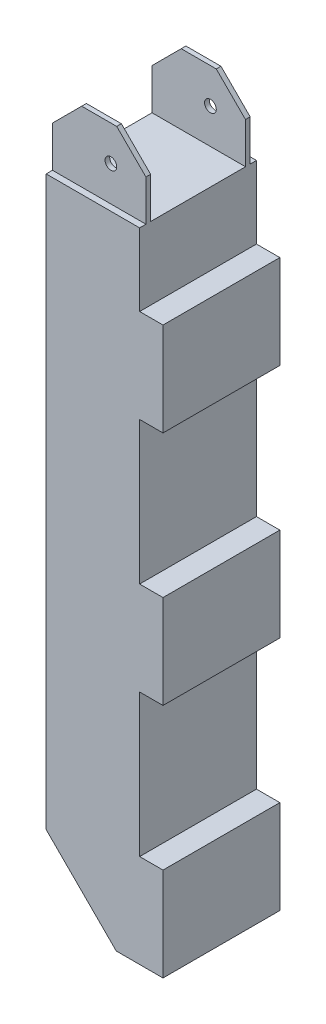
ISO-10303-21;
HEADER;
FILE_DESCRIPTION(('STEP AP214'),'2;1');
FILE_NAME('part.step','',(''),(''),'','','');
FILE_SCHEMA(('AUTOMOTIVE_DESIGN { 1 0 10303 214 1 1 1 1 }'));
ENDSEC;
DATA;
#1=APPLICATION_CONTEXT('core data for automotive mechanical design processes');
#2=APPLICATION_PROTOCOL_DEFINITION('international standard','automotive_design',2000,#1);
#3=PRODUCT_CONTEXT('',#1,'mechanical');
#4=PRODUCT('Part','Part','',(#3));
#5=PRODUCT_RELATED_PRODUCT_CATEGORY('part','',(#4));
#6=PRODUCT_DEFINITION_FORMATION('','',#4);
#7=PRODUCT_DEFINITION_CONTEXT('part definition',#1,'design');
#8=PRODUCT_DEFINITION('design','',#6,#7);
#9=PRODUCT_DEFINITION_SHAPE('','',#8);
#10=(LENGTH_UNIT() NAMED_UNIT(*) SI_UNIT(.MILLI.,.METRE.));
#11=(NAMED_UNIT(*) PLANE_ANGLE_UNIT() SI_UNIT($,.RADIAN.));
#12=(NAMED_UNIT(*) SI_UNIT($,.STERADIAN.) SOLID_ANGLE_UNIT());
#13=UNCERTAINTY_MEASURE_WITH_UNIT(LENGTH_MEASURE(1.E-05),#10,'distance_accuracy_value','');
#14=(GEOMETRIC_REPRESENTATION_CONTEXT(3) GLOBAL_UNCERTAINTY_ASSIGNED_CONTEXT((#13)) GLOBAL_UNIT_ASSIGNED_CONTEXT((#10,
#11,#12)) REPRESENTATION_CONTEXT('',''));
#15=CARTESIAN_POINT('',(0.,0.,0.));
#16=DIRECTION('',(0.,0.,1.));
#17=DIRECTION('',(1.,0.,0.));
#18=AXIS2_PLACEMENT_3D('',#15,#16,#17);
#19=CARTESIAN_POINT('',(-0.999999999999997,-69.7,134.626868356834));
#20=DIRECTION('',(0.,-1.,0.));
#21=DIRECTION('',(0.,0.,-1.));
#22=AXIS2_PLACEMENT_3D('',#19,#20,#21);
#23=PLANE('',#22);
#24=DIRECTION('',(1.,0.,0.));
#25=VECTOR('',#24,1.);
#26=CARTESIAN_POINT('',(-4.99999999999999,-69.7,0.27000000000007));
#27=LINE('',#26,#25);
#28=CARTESIAN_POINT('',(-3.74999999999999,-69.7,0.27000000000007));
#29=VERTEX_POINT('',#28);
#30=CARTESIAN_POINT('',(-2.25,-69.7,0.27000000000007));
#31=VERTEX_POINT('',#30);
#32=EDGE_CURVE('E281',#29,#31,#27,.T.);
#33=ORIENTED_EDGE('',*,*,#32,.F.);
#34=DIRECTION('',(0.,0.,1.));
#35=VECTOR('',#34,1.);
#36=CARTESIAN_POINT('',(-3.74999999999999,-69.7,134.626868356834));
#37=LINE('',#36,#35);
#38=CARTESIAN_POINT('',(-3.74999999999999,-69.7,0.470000000000069));
#39=VERTEX_POINT('',#38);
#40=EDGE_CURVE('E52',#29,#39,#37,.T.);
#41=ORIENTED_EDGE('',*,*,#40,.T.);
#42=DIRECTION('',(1.,0.,0.));
#43=VECTOR('',#42,1.);
#44=CARTESIAN_POINT('',(-4.99999999999999,-69.7,0.470000000000069));
#45=LINE('',#44,#43);
#46=CARTESIAN_POINT('',(-2.25,-69.7,0.470000000000069));
#47=VERTEX_POINT('',#46);
#48=EDGE_CURVE('E257',#39,#47,#45,.T.);
#49=ORIENTED_EDGE('',*,*,#48,.T.);
#50=DIRECTION('',(0.,0.,-1.));
#51=VECTOR('',#50,1.);
#52=CARTESIAN_POINT('',(-2.25,-69.7,134.626868356834));
#53=LINE('',#52,#51);
#54=EDGE_CURVE('E418',#47,#31,#53,.T.);
#55=ORIENTED_EDGE('',*,*,#54,.T.);
#56=EDGE_LOOP('',(#33,#41,#49,#55));
#57=FACE_BOUND('',#56,.T.);
#58=ADVANCED_FACE('F43',(#57),#23,.F.);
#59=CARTESIAN_POINT('',(-2.49999999999999,-71.2,0.));
#60=DIRECTION('',(0.,0.,1.));
#61=DIRECTION('',(1.,0.,0.));
#62=AXIS2_PLACEMENT_3D('',#59,#60,#61);
#63=CYLINDRICAL_SURFACE('',#62,0.25);
#64=CARTESIAN_POINT('',(-2.49999999999999,-71.2,0.470000000000069));
#65=DIRECTION('',(0.,0.,-1.));
#66=DIRECTION('',(-1.,0.,0.));
#67=AXIS2_PLACEMENT_3D('',#64,#65,#66);
#68=CIRCLE('',#67,0.25);
#69=CARTESIAN_POINT('',(-2.74999999999999,-71.2,0.470000000000069));
#70=VERTEX_POINT('',#69);
#71=EDGE_CURVE('E290',#70,#70,#68,.F.);
#72=ORIENTED_EDGE('',*,*,#71,.T.);
#73=EDGE_LOOP('',(#72));
#74=FACE_BOUND('',#73,.T.);
#75=CARTESIAN_POINT('',(-2.49999999999999,-71.2,0.27000000000007));
#76=DIRECTION('',(0.,0.,1.));
#77=DIRECTION('',(1.,0.,0.));
#78=AXIS2_PLACEMENT_3D('',#75,#76,#77);
#79=CIRCLE('',#78,0.25);
#80=CARTESIAN_POINT('',(-2.24999999999999,-71.2,0.27000000000007));
#81=VERTEX_POINT('',#80);
#82=EDGE_CURVE('E277',#81,#81,#79,.F.);
#83=ORIENTED_EDGE('',*,*,#82,.T.);
#84=EDGE_LOOP('',(#83));
#85=FACE_BOUND('',#84,.T.);
#86=ADVANCED_FACE('F499',(#74,#85),#63,.F.);
#87=CARTESIAN_POINT('',(0.,-100.,5.));
#88=DIRECTION('',(-1.,0.,0.));
#89=DIRECTION('',(0.,-1.,0.));
#90=AXIS2_PLACEMENT_3D('',#87,#88,#89);
#91=PLANE('',#90);
#92=DIRECTION('',(0.,1.,0.));
#93=VECTOR('',#92,1.);
#94=CARTESIAN_POINT('',(0.,-100.,5.));
#95=LINE('',#94,#93);
#96=CARTESIAN_POINT('',(0.,-89.9,5.));
#97=VERTEX_POINT('',#96);
#98=CARTESIAN_POINT('',(0.,-85.9,5.00000000000003));
#99=VERTEX_POINT('',#98);
#100=EDGE_CURVE('E366',#97,#99,#95,.T.);
#101=ORIENTED_EDGE('',*,*,#100,.F.);
#102=DIRECTION('',(0.,0.,1.));
#103=VECTOR('',#102,1.);
#104=CARTESIAN_POINT('',(0.,-89.9,5.));
#105=LINE('',#104,#103);
#106=CARTESIAN_POINT('',(0.,-89.9,0.));
#107=VERTEX_POINT('',#106);
#108=EDGE_CURVE('E302',#107,#97,#105,.T.);
#109=ORIENTED_EDGE('',*,*,#108,.F.);
#110=DIRECTION('',(0.,1.,0.));
#111=VECTOR('',#110,1.);
#112=CARTESIAN_POINT('',(0.,-100.,0.));
#113=LINE('',#112,#111);
#114=CARTESIAN_POINT('',(0.,-85.9,0.));
#115=VERTEX_POINT('',#114);
#116=EDGE_CURVE('E376',#107,#115,#113,.T.);
#117=ORIENTED_EDGE('',*,*,#116,.T.);
#118=DIRECTION('',(0.,0.,-1.));
#119=VECTOR('',#118,1.);
#120=CARTESIAN_POINT('',(0.,-85.9,5.00000000000003));
#121=LINE('',#120,#119);
#122=EDGE_CURVE('E336',#99,#115,#121,.T.);
#123=ORIENTED_EDGE('',*,*,#122,.F.);
#124=EDGE_LOOP('',(#101,#109,#117,#123));
#125=FACE_BOUND('',#124,.T.);
#126=ADVANCED_FACE('F505',(#125),#91,.F.);
#127=CARTESIAN_POINT('',(0.,-79.8,5.00000000000003));
#128=VERTEX_POINT('',#127);
#129=CARTESIAN_POINT('',(0.,-75.8,5.00000000000007));
#130=VERTEX_POINT('',#129);
#131=EDGE_CURVE('E367',#128,#130,#95,.T.);
#132=ORIENTED_EDGE('',*,*,#131,.F.);
#133=DIRECTION('',(0.,0.,1.));
#134=VECTOR('',#133,1.);
#135=CARTESIAN_POINT('',(0.,-79.8,5.00000000000003));
#136=LINE('',#135,#134);
#137=CARTESIAN_POINT('',(0.,-79.8,0.));
#138=VERTEX_POINT('',#137);
#139=EDGE_CURVE('E328',#138,#128,#136,.T.);
#140=ORIENTED_EDGE('',*,*,#139,.F.);
#141=CARTESIAN_POINT('',(0.,-75.8,0.));
#142=VERTEX_POINT('',#141);
#143=EDGE_CURVE('E317',#138,#142,#113,.T.);
#144=ORIENTED_EDGE('',*,*,#143,.T.);
#145=DIRECTION('',(0.,0.,-1.));
#146=VECTOR('',#145,1.);
#147=CARTESIAN_POINT('',(0.,-75.8,5.00000000000007));
#148=LINE('',#147,#146);
#149=EDGE_CURVE('E351',#130,#142,#148,.T.);
#150=ORIENTED_EDGE('',*,*,#149,.F.);
#151=EDGE_LOOP('',(#132,#140,#144,#150));
#152=FACE_BOUND('',#151,.T.);
#153=ADVANCED_FACE('F561',(#152),#91,.F.);
#154=CARTESIAN_POINT('',(0.,-100.,0.));
#155=VERTEX_POINT('',#154);
#156=CARTESIAN_POINT('',(0.,-96.,0.));
#157=VERTEX_POINT('',#156);
#158=EDGE_CURVE('E372',#155,#157,#113,.T.);
#159=ORIENTED_EDGE('',*,*,#158,.T.);
#160=DIRECTION('',(0.,0.,-1.));
#161=VECTOR('',#160,1.);
#162=CARTESIAN_POINT('',(0.,-96.,5.));
#163=LINE('',#162,#161);
#164=CARTESIAN_POINT('',(0.,-96.,5.));
#165=VERTEX_POINT('',#164);
#166=EDGE_CURVE('E310',#165,#157,#163,.T.);
#167=ORIENTED_EDGE('',*,*,#166,.F.);
#168=CARTESIAN_POINT('',(0.,-100.,5.));
#169=VERTEX_POINT('',#168);
#170=EDGE_CURVE('E362',#169,#165,#95,.T.);
#171=ORIENTED_EDGE('',*,*,#170,.F.);
#172=DIRECTION('',(0.,0.,-1.));
#173=VECTOR('',#172,1.);
#174=CARTESIAN_POINT('',(0.,-100.,5.));
#175=LINE('',#174,#173);
#176=EDGE_CURVE('E371',#169,#155,#175,.T.);
#177=ORIENTED_EDGE('',*,*,#176,.T.);
#178=EDGE_LOOP('',(#159,#167,#171,#177));
#179=FACE_BOUND('',#178,.T.);
#180=ADVANCED_FACE('F533',(#179),#91,.F.);
#181=CARTESIAN_POINT('',(-4.99999999999999,-60.,5.));
#182=DIRECTION('',(1.,0.,0.));
#183=DIRECTION('',(0.,1.,0.));
#184=AXIS2_PLACEMENT_3D('',#181,#182,#183);
#185=PLANE('',#184);
#186=DIRECTION('',(0.,1.,0.));
#187=VECTOR('',#186,1.);
#188=CARTESIAN_POINT('',(-4.99999999999999,-72.7,0.470000000000069));
#189=LINE('',#188,#187);
#190=CARTESIAN_POINT('',(-4.99999999999999,-72.7,0.470000000000069));
#191=VERTEX_POINT('',#190);
#192=CARTESIAN_POINT('',(-4.99999999999999,-70.95,0.470000000000069));
#193=VERTEX_POINT('',#192);
#194=EDGE_CURVE('E248',#191,#193,#189,.T.);
#195=ORIENTED_EDGE('',*,*,#194,.T.);
#196=DIRECTION('',(0.,0.,-1.));
#197=VECTOR('',#196,1.);
#198=CARTESIAN_POINT('',(-4.99999999999999,-70.95,5.));
#199=LINE('',#198,#197);
#200=CARTESIAN_POINT('',(-4.99999999999999,-70.95,0.27000000000007));
#201=VERTEX_POINT('',#200);
#202=EDGE_CURVE('E430',#193,#201,#199,.T.);
#203=ORIENTED_EDGE('',*,*,#202,.T.);
#204=DIRECTION('',(0.,-1.,0.));
#205=VECTOR('',#204,1.);
#206=CARTESIAN_POINT('',(-4.99999999999999,-69.7,0.27000000000007));
#207=LINE('',#206,#205);
#208=CARTESIAN_POINT('',(-4.99999999999999,-72.7,0.27000000000007));
#209=VERTEX_POINT('',#208);
#210=EDGE_CURVE('E293',#201,#209,#207,.T.);
#211=ORIENTED_EDGE('',*,*,#210,.T.);
#212=DIRECTION('',(0.,0.,-1.));
#213=VECTOR('',#212,1.);
#214=CARTESIAN_POINT('',(-4.99999999999999,-72.7,0.27000000000007));
#215=LINE('',#214,#213);
#216=CARTESIAN_POINT('',(-4.99999999999999,-72.7,0.));
#217=VERTEX_POINT('',#216);
#218=EDGE_CURVE('E283',#209,#217,#215,.T.);
#219=ORIENTED_EDGE('',*,*,#218,.T.);
#220=DIRECTION('',(0.,-1.,0.));
#221=VECTOR('',#220,1.);
#222=CARTESIAN_POINT('',(-4.99999999999999,-60.,0.));
#223=LINE('',#222,#221);
#224=CARTESIAN_POINT('',(-4.99999999999999,-97.,0.));
#225=VERTEX_POINT('',#224);
#226=EDGE_CURVE('E375',#217,#225,#223,.T.);
#227=ORIENTED_EDGE('',*,*,#226,.T.);
#228=DIRECTION('',(0.,0.,1.));
#229=VECTOR('',#228,1.);
#230=CARTESIAN_POINT('',(-4.99999999999999,-97.,5.));
#231=LINE('',#230,#229);
#232=CARTESIAN_POINT('',(-4.99999999999999,-97.,5.));
#233=VERTEX_POINT('',#232);
#234=EDGE_CURVE('E388',#225,#233,#231,.T.);
#235=ORIENTED_EDGE('',*,*,#234,.T.);
#236=DIRECTION('',(0.,-1.,0.));
#237=VECTOR('',#236,1.);
#238=CARTESIAN_POINT('',(-4.99999999999999,-60.,5.));
#239=LINE('',#238,#237);
#240=CARTESIAN_POINT('',(-4.99999999999999,-72.7,5.00000000000007));
#241=VERTEX_POINT('',#240);
#242=EDGE_CURVE('E365',#241,#233,#239,.T.);
#243=ORIENTED_EDGE('',*,*,#242,.F.);
#244=DIRECTION('',(0.,0.,-1.));
#245=VECTOR('',#244,1.);
#246=CARTESIAN_POINT('',(-4.99999999999999,-72.7,5.00000000000007));
#247=LINE('',#246,#245);
#248=CARTESIAN_POINT('',(-4.99999999999999,-72.7,4.73000000000007));
#249=VERTEX_POINT('',#248);
#250=EDGE_CURVE('E262',#241,#249,#247,.T.);
#251=ORIENTED_EDGE('',*,*,#250,.T.);
#252=DIRECTION('',(0.,1.,0.));
#253=VECTOR('',#252,1.);
#254=CARTESIAN_POINT('',(-4.99999999999999,-69.7,4.73000000000007));
#255=LINE('',#254,#253);
#256=CARTESIAN_POINT('',(-4.99999999999999,-70.95,4.73000000000007));
#257=VERTEX_POINT('',#256);
#258=EDGE_CURVE('E265',#249,#257,#255,.T.);
#259=ORIENTED_EDGE('',*,*,#258,.T.);
#260=DIRECTION('',(0.,0.,-1.));
#261=VECTOR('',#260,1.);
#262=CARTESIAN_POINT('',(-4.99999999999999,-70.95,5.));
#263=LINE('',#262,#261);
#264=CARTESIAN_POINT('',(-4.99999999999999,-70.95,4.53000000000007));
#265=VERTEX_POINT('',#264);
#266=EDGE_CURVE('E230',#257,#265,#263,.T.);
#267=ORIENTED_EDGE('',*,*,#266,.T.);
#268=DIRECTION('',(0.,-1.,0.));
#269=VECTOR('',#268,1.);
#270=CARTESIAN_POINT('',(-4.99999999999999,-69.7,4.53000000000007));
#271=LINE('',#270,#269);
#272=CARTESIAN_POINT('',(-4.99999999999999,-72.7,4.53000000000007));
#273=VERTEX_POINT('',#272);
#274=EDGE_CURVE('E222',#265,#273,#271,.T.);
#275=ORIENTED_EDGE('',*,*,#274,.T.);
#276=DIRECTION('',(0.,0.,-1.));
#277=VECTOR('',#276,1.);
#278=CARTESIAN_POINT('',(-4.99999999999999,-72.7,4.53000000000007));
#279=LINE('',#278,#277);
#280=EDGE_CURVE('E227',#273,#191,#279,.T.);
#281=ORIENTED_EDGE('',*,*,#280,.T.);
#282=EDGE_LOOP('',(#195,#203,#211,#219,#227,#235,#243,#251,#259,#267,#275,#281));
#283=FACE_BOUND('',#282,.T.);
#284=ADVANCED_FACE('F225',(#283),#185,.F.);
#285=CARTESIAN_POINT('',(0.,-100.,5.));
#286=DIRECTION('',(0.,1.,0.));
#287=DIRECTION('',(0.,0.,1.));
#288=AXIS2_PLACEMENT_3D('',#285,#286,#287);
#289=PLANE('',#288);
#290=DIRECTION('',(1.,0.,0.));
#291=VECTOR('',#290,1.);
#292=CARTESIAN_POINT('',(0.,-100.,5.));
#293=LINE('',#292,#291);
#294=CARTESIAN_POINT('',(-2.,-100.,5.));
#295=VERTEX_POINT('',#294);
#296=EDGE_CURVE('E369',#295,#169,#293,.T.);
#297=ORIENTED_EDGE('',*,*,#296,.F.);
#298=DIRECTION('',(0.,0.,-1.));
#299=VECTOR('',#298,1.);
#300=CARTESIAN_POINT('',(-2.,-100.,5.));
#301=LINE('',#300,#299);
#302=CARTESIAN_POINT('',(-2.,-100.,0.));
#303=VERTEX_POINT('',#302);
#304=EDGE_CURVE('E382',#295,#303,#301,.T.);
#305=ORIENTED_EDGE('',*,*,#304,.T.);
#306=DIRECTION('',(1.,0.,0.));
#307=VECTOR('',#306,1.);
#308=CARTESIAN_POINT('',(0.,-100.,0.));
#309=LINE('',#308,#307);
#310=EDGE_CURVE('E378',#303,#155,#309,.T.);
#311=ORIENTED_EDGE('',*,*,#310,.T.);
#312=ORIENTED_EDGE('',*,*,#176,.F.);
#313=EDGE_LOOP('',(#297,#305,#311,#312));
#314=FACE_BOUND('',#313,.T.);
#315=ADVANCED_FACE('F604',(#314),#289,.F.);
#316=CARTESIAN_POINT('',(-0.200000000000004,-37.2,5.));
#317=DIRECTION('',(0.,0.,-1.));
#318=DIRECTION('',(-1.,0.,0.));
#319=AXIS2_PLACEMENT_3D('',#316,#317,#318);
#320=PLANE('',#319);
#321=DIRECTION('',(0.,-1.,0.));
#322=VECTOR('',#321,1.);
#323=CARTESIAN_POINT('',(-0.999999999999997,-75.8,5.00000000000007));
#324=LINE('',#323,#322);
#325=CARTESIAN_POINT('',(-0.999999999999997,-72.7,5.00000000000007));
#326=VERTEX_POINT('',#325);
#327=CARTESIAN_POINT('',(-0.999999999999997,-75.8,5.00000000000007));
#328=VERTEX_POINT('',#327);
#329=EDGE_CURVE('E348',#326,#328,#324,.T.);
#330=ORIENTED_EDGE('',*,*,#329,.F.);
#331=DIRECTION('',(1.,0.,0.));
#332=VECTOR('',#331,1.);
#333=CARTESIAN_POINT('',(-4.99999999999999,-72.7,5.00000000000007));
#334=LINE('',#333,#332);
#335=EDGE_CURVE('E268',#241,#326,#334,.T.);
#336=ORIENTED_EDGE('',*,*,#335,.F.);
#337=ORIENTED_EDGE('',*,*,#242,.T.);
#338=DIRECTION('',(-0.707106781186546,0.707106781186549,0.));
#339=VECTOR('',#338,1.);
#340=CARTESIAN_POINT('',(-2.,-100.,5.));
#341=LINE('',#340,#339);
#342=EDGE_CURVE('E391',#233,#295,#341,.F.);
#343=ORIENTED_EDGE('',*,*,#342,.T.);
#344=ORIENTED_EDGE('',*,*,#296,.T.);
#345=ORIENTED_EDGE('',*,*,#170,.T.);
#346=DIRECTION('',(1.,0.,0.));
#347=VECTOR('',#346,1.);
#348=CARTESIAN_POINT('',(-0.999999999999996,-96.,5.));
#349=LINE('',#348,#347);
#350=CARTESIAN_POINT('',(-0.999999999999996,-96.,5.));
#351=VERTEX_POINT('',#350);
#352=EDGE_CURVE('E309',#351,#165,#349,.T.);
#353=ORIENTED_EDGE('',*,*,#352,.F.);
#354=DIRECTION('',(0.,-1.,0.));
#355=VECTOR('',#354,1.);
#356=CARTESIAN_POINT('',(-0.999999999999996,-96.,5.));
#357=LINE('',#356,#355);
#358=CARTESIAN_POINT('',(-0.999999999999996,-89.9,5.));
#359=VERTEX_POINT('',#358);
#360=EDGE_CURVE('E298',#359,#351,#357,.T.);
#361=ORIENTED_EDGE('',*,*,#360,.F.);
#362=DIRECTION('',(1.,0.,0.));
#363=VECTOR('',#362,1.);
#364=CARTESIAN_POINT('',(-0.999999999999996,-89.9,5.));
#365=LINE('',#364,#363);
#366=EDGE_CURVE('E314',#359,#97,#365,.T.);
#367=ORIENTED_EDGE('',*,*,#366,.T.);
#368=ORIENTED_EDGE('',*,*,#100,.T.);
#369=DIRECTION('',(1.,0.,0.));
#370=VECTOR('',#369,1.);
#371=CARTESIAN_POINT('',(-0.999999999999997,-85.9,5.00000000000003));
#372=LINE('',#371,#370);
#373=CARTESIAN_POINT('',(-0.999999999999997,-85.9,5.00000000000003));
#374=VERTEX_POINT('',#373);
#375=EDGE_CURVE('E335',#374,#99,#372,.T.);
#376=ORIENTED_EDGE('',*,*,#375,.F.);
#377=DIRECTION('',(0.,-1.,0.));
#378=VECTOR('',#377,1.);
#379=CARTESIAN_POINT('',(-0.999999999999997,-85.9,5.00000000000003));
#380=LINE('',#379,#378);
#381=CARTESIAN_POINT('',(-0.999999999999997,-79.8,5.00000000000003));
#382=VERTEX_POINT('',#381);
#383=EDGE_CURVE('E324',#382,#374,#380,.T.);
#384=ORIENTED_EDGE('',*,*,#383,.F.);
#385=DIRECTION('',(1.,0.,0.));
#386=VECTOR('',#385,1.);
#387=CARTESIAN_POINT('',(-0.999999999999997,-79.8,5.00000000000003));
#388=LINE('',#387,#386);
#389=EDGE_CURVE('E312',#382,#128,#388,.T.);
#390=ORIENTED_EDGE('',*,*,#389,.T.);
#391=ORIENTED_EDGE('',*,*,#131,.T.);
#392=DIRECTION('',(1.,0.,0.));
#393=VECTOR('',#392,1.);
#394=CARTESIAN_POINT('',(-0.999999999999997,-75.8,5.00000000000007));
#395=LINE('',#394,#393);
#396=EDGE_CURVE('E356',#328,#130,#395,.T.);
#397=ORIENTED_EDGE('',*,*,#396,.F.);
#398=EDGE_LOOP('',(#330,#336,#337,#343,#344,#345,#353,#361,#367,#368,#376,#384,#390,#391,#397));
#399=FACE_BOUND('',#398,.T.);
#400=ADVANCED_FACE('F459',(#399),#320,.F.);
#401=CARTESIAN_POINT('',(-0.200000000000004,-37.2,0.));
#402=DIRECTION('',(0.,0.,-1.));
#403=DIRECTION('',(-1.,0.,0.));
#404=AXIS2_PLACEMENT_3D('',#401,#402,#403);
#405=PLANE('',#404);
#406=DIRECTION('',(1.,0.,0.));
#407=VECTOR('',#406,1.);
#408=CARTESIAN_POINT('',(-4.99999999999999,-72.7,0.));
#409=LINE('',#408,#407);
#410=CARTESIAN_POINT('',(-0.999999999999997,-72.7,0.));
#411=VERTEX_POINT('',#410);
#412=EDGE_CURVE('E287',#217,#411,#409,.T.);
#413=ORIENTED_EDGE('',*,*,#412,.T.);
#414=DIRECTION('',(0.,1.,0.));
#415=VECTOR('',#414,1.);
#416=CARTESIAN_POINT('',(-0.999999999999997,-75.8,0.));
#417=LINE('',#416,#415);
#418=CARTESIAN_POINT('',(-0.999999999999997,-75.8,0.));
#419=VERTEX_POINT('',#418);
#420=EDGE_CURVE('E353',#419,#411,#417,.T.);
#421=ORIENTED_EDGE('',*,*,#420,.F.);
#422=DIRECTION('',(1.,0.,0.));
#423=VECTOR('',#422,1.);
#424=CARTESIAN_POINT('',(-0.999999999999997,-75.8,0.));
#425=LINE('',#424,#423);
#426=EDGE_CURVE('E338',#419,#142,#425,.T.);
#427=ORIENTED_EDGE('',*,*,#426,.T.);
#428=ORIENTED_EDGE('',*,*,#143,.F.);
#429=DIRECTION('',(1.,0.,0.));
#430=VECTOR('',#429,1.);
#431=CARTESIAN_POINT('',(-0.999999999999997,-79.8,0.));
#432=LINE('',#431,#430);
#433=CARTESIAN_POINT('',(-0.999999999999997,-79.8,0.));
#434=VERTEX_POINT('',#433);
#435=EDGE_CURVE('E342',#434,#138,#432,.T.);
#436=ORIENTED_EDGE('',*,*,#435,.F.);
#437=DIRECTION('',(0.,1.,0.));
#438=VECTOR('',#437,1.);
#439=CARTESIAN_POINT('',(-0.999999999999997,-85.9,0.));
#440=LINE('',#439,#438);
#441=CARTESIAN_POINT('',(-0.999999999999997,-85.9,0.));
#442=VERTEX_POINT('',#441);
#443=EDGE_CURVE('E330',#442,#434,#440,.T.);
#444=ORIENTED_EDGE('',*,*,#443,.F.);
#445=DIRECTION('',(1.,0.,0.));
#446=VECTOR('',#445,1.);
#447=CARTESIAN_POINT('',(-0.999999999999997,-85.9,0.));
#448=LINE('',#447,#446);
#449=EDGE_CURVE('E344',#442,#115,#448,.T.);
#450=ORIENTED_EDGE('',*,*,#449,.T.);
#451=ORIENTED_EDGE('',*,*,#116,.F.);
#452=DIRECTION('',(1.,0.,0.));
#453=VECTOR('',#452,1.);
#454=CARTESIAN_POINT('',(-0.999999999999996,-89.9,0.));
#455=LINE('',#454,#453);
#456=CARTESIAN_POINT('',(-0.999999999999996,-89.9,0.));
#457=VERTEX_POINT('',#456);
#458=EDGE_CURVE('E318',#457,#107,#455,.T.);
#459=ORIENTED_EDGE('',*,*,#458,.F.);
#460=DIRECTION('',(0.,1.,0.));
#461=VECTOR('',#460,1.);
#462=CARTESIAN_POINT('',(-0.999999999999996,-96.,0.));
#463=LINE('',#462,#461);
#464=CARTESIAN_POINT('',(-0.999999999999996,-96.,0.));
#465=VERTEX_POINT('',#464);
#466=EDGE_CURVE('E304',#465,#457,#463,.T.);
#467=ORIENTED_EDGE('',*,*,#466,.F.);
#468=DIRECTION('',(1.,0.,0.));
#469=VECTOR('',#468,1.);
#470=CARTESIAN_POINT('',(-0.999999999999996,-96.,0.));
#471=LINE('',#470,#469);
#472=EDGE_CURVE('E320',#465,#157,#471,.T.);
#473=ORIENTED_EDGE('',*,*,#472,.T.);
#474=ORIENTED_EDGE('',*,*,#158,.F.);
#475=ORIENTED_EDGE('',*,*,#310,.F.);
#476=DIRECTION('',(0.707106781186546,-0.707106781186549,0.));
#477=VECTOR('',#476,1.);
#478=CARTESIAN_POINT('',(-32.5,-69.4999999999999,0.));
#479=LINE('',#478,#477);
#480=EDGE_CURVE('E385',#303,#225,#479,.F.);
#481=ORIENTED_EDGE('',*,*,#480,.T.);
#482=ORIENTED_EDGE('',*,*,#226,.F.);
#483=EDGE_LOOP('',(#413,#421,#427,#428,#436,#444,#450,#451,#459,#467,#473,#474,#475,#481,#482));
#484=FACE_BOUND('',#483,.T.);
#485=ADVANCED_FACE('F446',(#484),#405,.T.);
#486=CARTESIAN_POINT('',(-0.999999999999997,-75.8,5.00000000000007));
#487=DIRECTION('',(0.,-1.,0.));
#488=DIRECTION('',(1.,0.,0.));
#489=AXIS2_PLACEMENT_3D('',#486,#487,#488);
#490=PLANE('',#489);
#491=ORIENTED_EDGE('',*,*,#149,.T.);
#492=ORIENTED_EDGE('',*,*,#426,.F.);
#493=DIRECTION('',(0.,0.,-1.));
#494=VECTOR('',#493,1.);
#495=CARTESIAN_POINT('',(-0.999999999999997,-75.8,5.00000000000007));
#496=LINE('',#495,#494);
#497=EDGE_CURVE('E350',#328,#419,#496,.T.);
#498=ORIENTED_EDGE('',*,*,#497,.F.);
#499=ORIENTED_EDGE('',*,*,#396,.T.);
#500=EDGE_LOOP('',(#491,#492,#498,#499));
#501=FACE_BOUND('',#500,.T.);
#502=ADVANCED_FACE('F599',(#501),#490,.F.);
#503=CARTESIAN_POINT('',(-1.,0.,0.));
#504=DIRECTION('',(-1.,0.,0.));
#505=DIRECTION('',(0.,-1.,0.));
#506=AXIS2_PLACEMENT_3D('',#503,#504,#505);
#507=PLANE('',#506);
#508=DIRECTION('',(0.,-1.,0.));
#509=VECTOR('',#508,1.);
#510=CARTESIAN_POINT('',(-0.999999999999997,-69.7,0.27000000000007));
#511=LINE('',#510,#509);
#512=CARTESIAN_POINT('',(-0.999999999999997,-70.95,0.27000000000007));
#513=VERTEX_POINT('',#512);
#514=CARTESIAN_POINT('',(-0.999999999999997,-72.7,0.27000000000007));
#515=VERTEX_POINT('',#514);
#516=EDGE_CURVE('E272',#513,#515,#511,.T.);
#517=ORIENTED_EDGE('',*,*,#516,.F.);
#518=DIRECTION('',(0.,0.,1.));
#519=VECTOR('',#518,1.);
#520=CARTESIAN_POINT('',(-0.999999999999997,-70.95,0.));
#521=LINE('',#520,#519);
#522=CARTESIAN_POINT('',(-0.999999999999997,-70.95,0.470000000000069));
#523=VERTEX_POINT('',#522);
#524=EDGE_CURVE('E412',#513,#523,#521,.T.);
#525=ORIENTED_EDGE('',*,*,#524,.T.);
#526=DIRECTION('',(0.,1.,0.));
#527=VECTOR('',#526,1.);
#528=CARTESIAN_POINT('',(-0.999999999999997,-72.7,0.470000000000069));
#529=LINE('',#528,#527);
#530=CARTESIAN_POINT('',(-0.999999999999997,-72.7,0.470000000000069));
#531=VERTEX_POINT('',#530);
#532=EDGE_CURVE('E232',#531,#523,#529,.T.);
#533=ORIENTED_EDGE('',*,*,#532,.F.);
#534=DIRECTION('',(0.,0.,-1.));
#535=VECTOR('',#534,1.);
#536=CARTESIAN_POINT('',(-0.999999999999997,-72.7,4.53000000000007));
#537=LINE('',#536,#535);
#538=CARTESIAN_POINT('',(-0.999999999999997,-72.7,4.53000000000007));
#539=VERTEX_POINT('',#538);
#540=EDGE_CURVE('E253',#539,#531,#537,.T.);
#541=ORIENTED_EDGE('',*,*,#540,.F.);
#542=DIRECTION('',(0.,-1.,0.));
#543=VECTOR('',#542,1.);
#544=CARTESIAN_POINT('',(-0.999999999999997,-69.7,4.53000000000007));
#545=LINE('',#544,#543);
#546=CARTESIAN_POINT('',(-0.999999999999997,-70.95,4.53000000000007));
#547=VERTEX_POINT('',#546);
#548=EDGE_CURVE('E239',#547,#539,#545,.T.);
#549=ORIENTED_EDGE('',*,*,#548,.F.);
#550=DIRECTION('',(0.,0.,1.));
#551=VECTOR('',#550,1.);
#552=CARTESIAN_POINT('',(-0.999999999999997,-70.95,0.));
#553=LINE('',#552,#551);
#554=CARTESIAN_POINT('',(-0.999999999999997,-70.95,4.73000000000007));
#555=VERTEX_POINT('',#554);
#556=EDGE_CURVE('E393',#547,#555,#553,.T.);
#557=ORIENTED_EDGE('',*,*,#556,.T.);
#558=DIRECTION('',(0.,1.,0.));
#559=VECTOR('',#558,1.);
#560=CARTESIAN_POINT('',(-0.999999999999997,-69.7,4.73000000000007));
#561=LINE('',#560,#559);
#562=CARTESIAN_POINT('',(-0.999999999999997,-72.7,4.73000000000007));
#563=VERTEX_POINT('',#562);
#564=EDGE_CURVE('E266',#563,#555,#561,.T.);
#565=ORIENTED_EDGE('',*,*,#564,.F.);
#566=DIRECTION('',(0.,0.,-1.));
#567=VECTOR('',#566,1.);
#568=CARTESIAN_POINT('',(-0.999999999999997,-72.7,5.00000000000007));
#569=LINE('',#568,#567);
#570=EDGE_CURVE('E269',#326,#563,#569,.T.);
#571=ORIENTED_EDGE('',*,*,#570,.F.);
#572=ORIENTED_EDGE('',*,*,#329,.T.);
#573=ORIENTED_EDGE('',*,*,#497,.T.);
#574=ORIENTED_EDGE('',*,*,#420,.T.);
#575=DIRECTION('',(0.,0.,-1.));
#576=VECTOR('',#575,1.);
#577=CARTESIAN_POINT('',(-0.999999999999997,-72.7,0.27000000000007));
#578=LINE('',#577,#576);
#579=EDGE_CURVE('E291',#515,#411,#578,.T.);
#580=ORIENTED_EDGE('',*,*,#579,.F.);
#581=EDGE_LOOP('',(#517,#525,#533,#541,#549,#557,#565,#571,#572,#573,#574,#580));
#582=FACE_BOUND('',#581,.T.);
#583=ADVANCED_FACE('F467',(#582),#507,.F.);
#584=CARTESIAN_POINT('',(-0.999999999999997,-79.8,5.00000000000003));
#585=DIRECTION('',(0.,1.,0.));
#586=DIRECTION('',(-1.,0.,0.));
#587=AXIS2_PLACEMENT_3D('',#584,#585,#586);
#588=PLANE('',#587);
#589=ORIENTED_EDGE('',*,*,#139,.T.);
#590=ORIENTED_EDGE('',*,*,#389,.F.);
#591=DIRECTION('',(0.,0.,1.));
#592=VECTOR('',#591,1.);
#593=CARTESIAN_POINT('',(-0.999999999999997,-79.8,5.00000000000003));
#594=LINE('',#593,#592);
#595=EDGE_CURVE('E332',#434,#382,#594,.T.);
#596=ORIENTED_EDGE('',*,*,#595,.F.);
#597=ORIENTED_EDGE('',*,*,#435,.T.);
#598=EDGE_LOOP('',(#589,#590,#596,#597));
#599=FACE_BOUND('',#598,.T.);
#600=ADVANCED_FACE('F581',(#599),#588,.F.);
#601=CARTESIAN_POINT('',(-0.999999999999997,-85.9,5.00000000000003));
#602=DIRECTION('',(0.,-1.,0.));
#603=DIRECTION('',(1.,0.,0.));
#604=AXIS2_PLACEMENT_3D('',#601,#602,#603);
#605=PLANE('',#604);
#606=ORIENTED_EDGE('',*,*,#122,.T.);
#607=ORIENTED_EDGE('',*,*,#449,.F.);
#608=DIRECTION('',(0.,0.,-1.));
#609=VECTOR('',#608,1.);
#610=CARTESIAN_POINT('',(-0.999999999999997,-85.9,5.00000000000003));
#611=LINE('',#610,#609);
#612=EDGE_CURVE('E327',#374,#442,#611,.T.);
#613=ORIENTED_EDGE('',*,*,#612,.F.);
#614=ORIENTED_EDGE('',*,*,#375,.T.);
#615=EDGE_LOOP('',(#606,#607,#613,#614));
#616=FACE_BOUND('',#615,.T.);
#617=ADVANCED_FACE('F575',(#616),#605,.F.);
#618=CARTESIAN_POINT('',(-1.,0.,0.));
#619=DIRECTION('',(-1.,0.,0.));
#620=DIRECTION('',(0.,-1.,0.));
#621=AXIS2_PLACEMENT_3D('',#618,#619,#620);
#622=PLANE('',#621);
#623=ORIENTED_EDGE('',*,*,#383,.T.);
#624=ORIENTED_EDGE('',*,*,#612,.T.);
#625=ORIENTED_EDGE('',*,*,#443,.T.);
#626=ORIENTED_EDGE('',*,*,#595,.T.);
#627=EDGE_LOOP('',(#623,#624,#625,#626));
#628=FACE_BOUND('',#627,.T.);
#629=ADVANCED_FACE('F583',(#628),#622,.F.);
#630=CARTESIAN_POINT('',(-0.999999999999996,-89.9,5.));
#631=DIRECTION('',(0.,1.,0.));
#632=DIRECTION('',(-1.,0.,0.));
#633=AXIS2_PLACEMENT_3D('',#630,#631,#632);
#634=PLANE('',#633);
#635=ORIENTED_EDGE('',*,*,#108,.T.);
#636=ORIENTED_EDGE('',*,*,#366,.F.);
#637=DIRECTION('',(0.,0.,1.));
#638=VECTOR('',#637,1.);
#639=CARTESIAN_POINT('',(-0.999999999999996,-89.9,5.));
#640=LINE('',#639,#638);
#641=EDGE_CURVE('E306',#457,#359,#640,.T.);
#642=ORIENTED_EDGE('',*,*,#641,.F.);
#643=ORIENTED_EDGE('',*,*,#458,.T.);
#644=EDGE_LOOP('',(#635,#636,#642,#643));
#645=FACE_BOUND('',#644,.T.);
#646=ADVANCED_FACE('F585',(#645),#634,.F.);
#647=CARTESIAN_POINT('',(-0.999999999999996,-96.,5.));
#648=DIRECTION('',(0.,-1.,0.));
#649=DIRECTION('',(1.,0.,0.));
#650=AXIS2_PLACEMENT_3D('',#647,#648,#649);
#651=PLANE('',#650);
#652=ORIENTED_EDGE('',*,*,#166,.T.);
#653=ORIENTED_EDGE('',*,*,#472,.F.);
#654=DIRECTION('',(0.,0.,-1.));
#655=VECTOR('',#654,1.);
#656=CARTESIAN_POINT('',(-0.999999999999996,-96.,5.));
#657=LINE('',#656,#655);
#658=EDGE_CURVE('E301',#351,#465,#657,.T.);
#659=ORIENTED_EDGE('',*,*,#658,.F.);
#660=ORIENTED_EDGE('',*,*,#352,.T.);
#661=EDGE_LOOP('',(#652,#653,#659,#660));
#662=FACE_BOUND('',#661,.T.);
#663=ADVANCED_FACE('F525',(#662),#651,.F.);
#664=CARTESIAN_POINT('',(-1.,0.,0.));
#665=DIRECTION('',(-1.,0.,0.));
#666=DIRECTION('',(0.,-1.,0.));
#667=AXIS2_PLACEMENT_3D('',#664,#665,#666);
#668=PLANE('',#667);
#669=ORIENTED_EDGE('',*,*,#360,.T.);
#670=ORIENTED_EDGE('',*,*,#658,.T.);
#671=ORIENTED_EDGE('',*,*,#466,.T.);
#672=ORIENTED_EDGE('',*,*,#641,.T.);
#673=EDGE_LOOP('',(#669,#670,#671,#672));
#674=FACE_BOUND('',#673,.T.);
#675=ADVANCED_FACE('F518',(#674),#668,.F.);
#676=CARTESIAN_POINT('',(-2.,-100.,5.));
#677=DIRECTION('',(0.707106781186549,0.707106781186546,0.));
#678=DIRECTION('',(0.,0.,-1.));
#679=AXIS2_PLACEMENT_3D('',#676,#677,#678);
#680=PLANE('',#679);
#681=ORIENTED_EDGE('',*,*,#342,.F.);
#682=ORIENTED_EDGE('',*,*,#234,.F.);
#683=ORIENTED_EDGE('',*,*,#480,.F.);
#684=ORIENTED_EDGE('',*,*,#304,.F.);
#685=EDGE_LOOP('',(#681,#682,#683,#684));
#686=FACE_BOUND('',#685,.T.);
#687=ADVANCED_FACE('F454',(#686),#680,.F.);
#688=DIRECTION('',(1.,0.,0.));
#689=VECTOR('',#688,1.);
#690=CARTESIAN_POINT('',(-4.99999999999999,-69.7,4.53000000000007));
#691=LINE('',#690,#689);
#692=CARTESIAN_POINT('',(-3.74999999999999,-69.7,4.53000000000007));
#693=VERTEX_POINT('',#692);
#694=CARTESIAN_POINT('',(-2.25,-69.7,4.53000000000007));
#695=VERTEX_POINT('',#694);
#696=EDGE_CURVE('E244',#693,#695,#691,.T.);
#697=ORIENTED_EDGE('',*,*,#696,.F.);
#698=DIRECTION('',(0.,0.,1.));
#699=VECTOR('',#698,1.);
#700=CARTESIAN_POINT('',(-3.74999999999999,-69.7,134.626868356834));
#701=LINE('',#700,#699);
#702=CARTESIAN_POINT('',(-3.74999999999999,-69.7,4.73000000000007));
#703=VERTEX_POINT('',#702);
#704=EDGE_CURVE('E426',#693,#703,#701,.T.);
#705=ORIENTED_EDGE('',*,*,#704,.T.);
#706=DIRECTION('',(1.,0.,0.));
#707=VECTOR('',#706,1.);
#708=CARTESIAN_POINT('',(-4.99999999999999,-69.7,4.73000000000007));
#709=LINE('',#708,#707);
#710=CARTESIAN_POINT('',(-2.25,-69.7,4.73000000000007));
#711=VERTEX_POINT('',#710);
#712=EDGE_CURVE('E275',#703,#711,#709,.T.);
#713=ORIENTED_EDGE('',*,*,#712,.T.);
#714=DIRECTION('',(0.,0.,-1.));
#715=VECTOR('',#714,1.);
#716=CARTESIAN_POINT('',(-2.25,-69.7,134.626868356834));
#717=LINE('',#716,#715);
#718=EDGE_CURVE('E407',#711,#695,#717,.T.);
#719=ORIENTED_EDGE('',*,*,#718,.T.);
#720=EDGE_LOOP('',(#697,#705,#713,#719));
#721=FACE_BOUND('',#720,.T.);
#722=ADVANCED_FACE('F482',(#721),#23,.F.);
#723=CARTESIAN_POINT('',(-4.99999999999999,-69.7,0.27000000000007));
#724=DIRECTION('',(0.,0.,1.));
#725=DIRECTION('',(1.,0.,0.));
#726=AXIS2_PLACEMENT_3D('',#723,#724,#725);
#727=PLANE('',#726);
#728=ORIENTED_EDGE('',*,*,#210,.F.);
#729=DIRECTION('',(-0.707106781186548,-0.707106781186548,0.));
#730=VECTOR('',#729,1.);
#731=CARTESIAN_POINT('',(-4.99999999999999,-70.95,0.27000000000007));
#732=LINE('',#731,#730);
#733=EDGE_CURVE('E66',#201,#29,#732,.F.);
#734=ORIENTED_EDGE('',*,*,#733,.T.);
#735=ORIENTED_EDGE('',*,*,#32,.T.);
#736=DIRECTION('',(-0.707106781186548,0.707106781186547,0.));
#737=VECTOR('',#736,1.);
#738=CARTESIAN_POINT('',(-0.999999999999997,-70.95,0.27000000000007));
#739=LINE('',#738,#737);
#740=EDGE_CURVE('E421',#31,#513,#739,.F.);
#741=ORIENTED_EDGE('',*,*,#740,.T.);
#742=ORIENTED_EDGE('',*,*,#516,.T.);
#743=DIRECTION('',(1.,0.,0.));
#744=VECTOR('',#743,1.);
#745=CARTESIAN_POINT('',(-4.99999999999999,-72.7,0.27000000000007));
#746=LINE('',#745,#744);
#747=EDGE_CURVE('E284',#209,#515,#746,.T.);
#748=ORIENTED_EDGE('',*,*,#747,.F.);
#749=EDGE_LOOP('',(#728,#734,#735,#741,#742,#748));
#750=FACE_BOUND('',#749,.T.);
#751=ORIENTED_EDGE('',*,*,#82,.F.);
#752=EDGE_LOOP('',(#751));
#753=FACE_BOUND('',#752,.T.);
#754=ADVANCED_FACE('F437',(#750,#753),#727,.F.);
#755=CARTESIAN_POINT('',(-4.99999999999999,-72.7,0.27000000000007));
#756=DIRECTION('',(0.,-1.,0.));
#757=DIRECTION('',(1.,0.,0.));
#758=AXIS2_PLACEMENT_3D('',#755,#756,#757);
#759=PLANE('',#758);
#760=ORIENTED_EDGE('',*,*,#579,.T.);
#761=ORIENTED_EDGE('',*,*,#412,.F.);
#762=ORIENTED_EDGE('',*,*,#218,.F.);
#763=ORIENTED_EDGE('',*,*,#747,.T.);
#764=EDGE_LOOP('',(#760,#761,#762,#763));
#765=FACE_BOUND('',#764,.T.);
#766=ADVANCED_FACE('F443',(#765),#759,.F.);
#767=CARTESIAN_POINT('',(-4.99999999999999,-69.7,4.73000000000007));
#768=DIRECTION('',(0.,0.,-1.));
#769=DIRECTION('',(-1.,0.,0.));
#770=AXIS2_PLACEMENT_3D('',#767,#768,#769);
#771=PLANE('',#770);
#772=ORIENTED_EDGE('',*,*,#712,.F.);
#773=DIRECTION('',(0.707106781186548,0.707106781186548,0.));
#774=VECTOR('',#773,1.);
#775=CARTESIAN_POINT('',(-4.99999999999999,-70.95,4.73000000000007));
#776=LINE('',#775,#774);
#777=EDGE_CURVE('E428',#703,#257,#776,.F.);
#778=ORIENTED_EDGE('',*,*,#777,.T.);
#779=ORIENTED_EDGE('',*,*,#258,.F.);
#780=DIRECTION('',(1.,0.,0.));
#781=VECTOR('',#780,1.);
#782=CARTESIAN_POINT('',(-4.99999999999999,-72.7,4.73000000000007));
#783=LINE('',#782,#781);
#784=EDGE_CURVE('E278',#249,#563,#783,.T.);
#785=ORIENTED_EDGE('',*,*,#784,.T.);
#786=ORIENTED_EDGE('',*,*,#564,.T.);
#787=DIRECTION('',(0.707106781186548,-0.707106781186547,0.));
#788=VECTOR('',#787,1.);
#789=CARTESIAN_POINT('',(-0.999999999999997,-70.95,4.73000000000007));
#790=LINE('',#789,#788);
#791=EDGE_CURVE('E404',#555,#711,#790,.F.);
#792=ORIENTED_EDGE('',*,*,#791,.T.);
#793=EDGE_LOOP('',(#772,#778,#779,#785,#786,#792));
#794=FACE_BOUND('',#793,.T.);
#795=CARTESIAN_POINT('',(-2.49999999999999,-71.2,4.73000000000007));
#796=DIRECTION('',(0.,0.,-1.));
#797=DIRECTION('',(-1.,0.,0.));
#798=AXIS2_PLACEMENT_3D('',#795,#796,#797);
#799=CIRCLE('',#798,0.25);
#800=CARTESIAN_POINT('',(-2.74999999999999,-71.2,4.73000000000007));
#801=VERTEX_POINT('',#800);
#802=EDGE_CURVE('E358',#801,#801,#799,.F.);
#803=ORIENTED_EDGE('',*,*,#802,.F.);
#804=EDGE_LOOP('',(#803));
#805=FACE_BOUND('',#804,.T.);
#806=ADVANCED_FACE('F472',(#794,#805),#771,.F.);
#807=CARTESIAN_POINT('',(-4.99999999999999,-72.7,5.00000000000007));
#808=DIRECTION('',(0.,-1.,0.));
#809=DIRECTION('',(1.,0.,0.));
#810=AXIS2_PLACEMENT_3D('',#807,#808,#809);
#811=PLANE('',#810);
#812=ORIENTED_EDGE('',*,*,#570,.T.);
#813=ORIENTED_EDGE('',*,*,#784,.F.);
#814=ORIENTED_EDGE('',*,*,#250,.F.);
#815=ORIENTED_EDGE('',*,*,#335,.T.);
#816=EDGE_LOOP('',(#812,#813,#814,#815));
#817=FACE_BOUND('',#816,.T.);
#818=ADVANCED_FACE('F464',(#817),#811,.F.);
#819=CARTESIAN_POINT('',(-2.49999999999999,-71.2,4.53000000000007));
#820=DIRECTION('',(0.,0.,1.));
#821=DIRECTION('',(1.,0.,0.));
#822=AXIS2_PLACEMENT_3D('',#819,#820,#821);
#823=CIRCLE('',#822,0.25);
#824=CARTESIAN_POINT('',(-2.24999999999999,-71.2,4.53000000000007));
#825=VERTEX_POINT('',#824);
#826=EDGE_CURVE('E259',#825,#825,#823,.F.);
#827=ORIENTED_EDGE('',*,*,#826,.T.);
#828=EDGE_LOOP('',(#827));
#829=FACE_BOUND('',#828,.T.);
#830=ORIENTED_EDGE('',*,*,#802,.T.);
#831=EDGE_LOOP('',(#830));
#832=FACE_BOUND('',#831,.T.);
#833=ADVANCED_FACE('F508',(#829,#832),#63,.F.);
#834=CARTESIAN_POINT('',(-4.99999999999999,-72.7,0.470000000000069));
#835=DIRECTION('',(0.,0.,-1.));
#836=DIRECTION('',(-1.,0.,0.));
#837=AXIS2_PLACEMENT_3D('',#834,#835,#836);
#838=PLANE('',#837);
#839=ORIENTED_EDGE('',*,*,#48,.F.);
#840=DIRECTION('',(0.707106781186548,0.707106781186548,0.));
#841=VECTOR('',#840,1.);
#842=CARTESIAN_POINT('',(-4.99999999999999,-70.95,0.470000000000069));
#843=LINE('',#842,#841);
#844=EDGE_CURVE('E11',#39,#193,#843,.F.);
#845=ORIENTED_EDGE('',*,*,#844,.T.);
#846=ORIENTED_EDGE('',*,*,#194,.F.);
#847=DIRECTION('',(1.,0.,0.));
#848=VECTOR('',#847,1.);
#849=CARTESIAN_POINT('',(-4.99999999999999,-72.7,0.470000000000069));
#850=LINE('',#849,#848);
#851=EDGE_CURVE('E243',#191,#531,#850,.T.);
#852=ORIENTED_EDGE('',*,*,#851,.T.);
#853=ORIENTED_EDGE('',*,*,#532,.T.);
#854=DIRECTION('',(0.707106781186548,-0.707106781186547,0.));
#855=VECTOR('',#854,1.);
#856=CARTESIAN_POINT('',(-0.999999999999997,-70.95,0.470000000000069));
#857=LINE('',#856,#855);
#858=EDGE_CURVE('E415',#523,#47,#857,.F.);
#859=ORIENTED_EDGE('',*,*,#858,.T.);
#860=EDGE_LOOP('',(#839,#845,#846,#852,#853,#859));
#861=FACE_BOUND('',#860,.T.);
#862=ORIENTED_EDGE('',*,*,#71,.F.);
#863=EDGE_LOOP('',(#862));
#864=FACE_BOUND('',#863,.T.);
#865=ADVANCED_FACE('F489',(#861,#864),#838,.F.);
#866=CARTESIAN_POINT('',(-4.99999999999999,-69.7,4.53000000000007));
#867=DIRECTION('',(0.,0.,1.));
#868=DIRECTION('',(1.,0.,0.));
#869=AXIS2_PLACEMENT_3D('',#866,#867,#868);
#870=PLANE('',#869);
#871=ORIENTED_EDGE('',*,*,#274,.F.);
#872=DIRECTION('',(-0.707106781186548,-0.707106781186548,0.));
#873=VECTOR('',#872,1.);
#874=CARTESIAN_POINT('',(-4.99999999999999,-70.95,4.53000000000007));
#875=LINE('',#874,#873);
#876=EDGE_CURVE('E424',#265,#693,#875,.F.);
#877=ORIENTED_EDGE('',*,*,#876,.T.);
#878=ORIENTED_EDGE('',*,*,#696,.T.);
#879=DIRECTION('',(-0.707106781186548,0.707106781186547,0.));
#880=VECTOR('',#879,1.);
#881=CARTESIAN_POINT('',(-0.999999999999997,-70.95,4.53000000000007));
#882=LINE('',#881,#880);
#883=EDGE_CURVE('E410',#695,#547,#882,.F.);
#884=ORIENTED_EDGE('',*,*,#883,.T.);
#885=ORIENTED_EDGE('',*,*,#548,.T.);
#886=DIRECTION('',(1.,0.,0.));
#887=VECTOR('',#886,1.);
#888=CARTESIAN_POINT('',(-4.99999999999999,-72.7,4.53000000000007));
#889=LINE('',#888,#887);
#890=EDGE_CURVE('E235',#273,#539,#889,.T.);
#891=ORIENTED_EDGE('',*,*,#890,.F.);
#892=EDGE_LOOP('',(#871,#877,#878,#884,#885,#891));
#893=FACE_BOUND('',#892,.T.);
#894=ORIENTED_EDGE('',*,*,#826,.F.);
#895=EDGE_LOOP('',(#894));
#896=FACE_BOUND('',#895,.T.);
#897=ADVANCED_FACE('F236',(#893,#896),#870,.F.);
#898=CARTESIAN_POINT('',(-4.99999999999999,-72.7,4.53000000000007));
#899=DIRECTION('',(0.,-1.,0.));
#900=DIRECTION('',(1.,0.,0.));
#901=AXIS2_PLACEMENT_3D('',#898,#899,#900);
#902=PLANE('',#901);
#903=ORIENTED_EDGE('',*,*,#540,.T.);
#904=ORIENTED_EDGE('',*,*,#851,.F.);
#905=ORIENTED_EDGE('',*,*,#280,.F.);
#906=ORIENTED_EDGE('',*,*,#890,.T.);
#907=EDGE_LOOP('',(#903,#904,#905,#906));
#908=FACE_BOUND('',#907,.T.);
#909=ADVANCED_FACE('F246',(#908),#902,.F.);
#910=CARTESIAN_POINT('',(-0.999999999999997,-70.95,0.));
#911=DIRECTION('',(-0.707106781186547,-0.707106781186548,0.));
#912=DIRECTION('',(0.,0.,1.));
#913=AXIS2_PLACEMENT_3D('',#910,#911,#912);
#914=PLANE('',#913);
#915=ORIENTED_EDGE('',*,*,#883,.F.);
#916=ORIENTED_EDGE('',*,*,#718,.F.);
#917=ORIENTED_EDGE('',*,*,#791,.F.);
#918=ORIENTED_EDGE('',*,*,#556,.F.);
#919=EDGE_LOOP('',(#915,#916,#917,#918));
#920=FACE_BOUND('',#919,.T.);
#921=ADVANCED_FACE('F485',(#920),#914,.F.);
#922=CARTESIAN_POINT('',(-0.999999999999997,-70.95,0.));
#923=DIRECTION('',(-0.707106781186547,-0.707106781186548,0.));
#924=DIRECTION('',(0.,0.,1.));
#925=AXIS2_PLACEMENT_3D('',#922,#923,#924);
#926=PLANE('',#925);
#927=ORIENTED_EDGE('',*,*,#740,.F.);
#928=ORIENTED_EDGE('',*,*,#54,.F.);
#929=ORIENTED_EDGE('',*,*,#858,.F.);
#930=ORIENTED_EDGE('',*,*,#524,.F.);
#931=EDGE_LOOP('',(#927,#928,#929,#930));
#932=FACE_BOUND('',#931,.T.);
#933=ADVANCED_FACE('F497',(#932),#926,.F.);
#934=CARTESIAN_POINT('',(-4.99999999999999,-70.95,5.));
#935=DIRECTION('',(0.707106781186547,-0.707106781186547,0.));
#936=DIRECTION('',(0.,0.,-1.));
#937=AXIS2_PLACEMENT_3D('',#934,#935,#936);
#938=PLANE('',#937);
#939=ORIENTED_EDGE('',*,*,#777,.F.);
#940=ORIENTED_EDGE('',*,*,#704,.F.);
#941=ORIENTED_EDGE('',*,*,#876,.F.);
#942=ORIENTED_EDGE('',*,*,#266,.F.);
#943=EDGE_LOOP('',(#939,#940,#941,#942));
#944=FACE_BOUND('',#943,.T.);
#945=ADVANCED_FACE('F478',(#944),#938,.F.);
#946=CARTESIAN_POINT('',(-4.99999999999999,-70.95,5.));
#947=DIRECTION('',(0.707106781186547,-0.707106781186547,0.));
#948=DIRECTION('',(0.,0.,-1.));
#949=AXIS2_PLACEMENT_3D('',#946,#947,#948);
#950=PLANE('',#949);
#951=ORIENTED_EDGE('',*,*,#844,.F.);
#952=ORIENTED_EDGE('',*,*,#40,.F.);
#953=ORIENTED_EDGE('',*,*,#733,.F.);
#954=ORIENTED_EDGE('',*,*,#202,.F.);
#955=EDGE_LOOP('',(#951,#952,#953,#954));
#956=FACE_BOUND('',#955,.T.);
#957=ADVANCED_FACE('F46',(#956),#950,.F.);
#958=CLOSED_SHELL('',(#58,#86,#126,#153,#180,#284,#315,#400,#485,#502,#583,#600,#617,#629,#646,
#663,#675,#687,#722,#754,#766,#806,#818,#833,#865,#897,#909,#921,#933,#945,#957));
#959=MANIFOLD_SOLID_BREP('B2',#958);
#960=ADVANCED_BREP_SHAPE_REPRESENTATION('',(#18,#959),#14);
#961=SHAPE_DEFINITION_REPRESENTATION(#9,#960);
ENDSEC;
END-ISO-10303-21;
